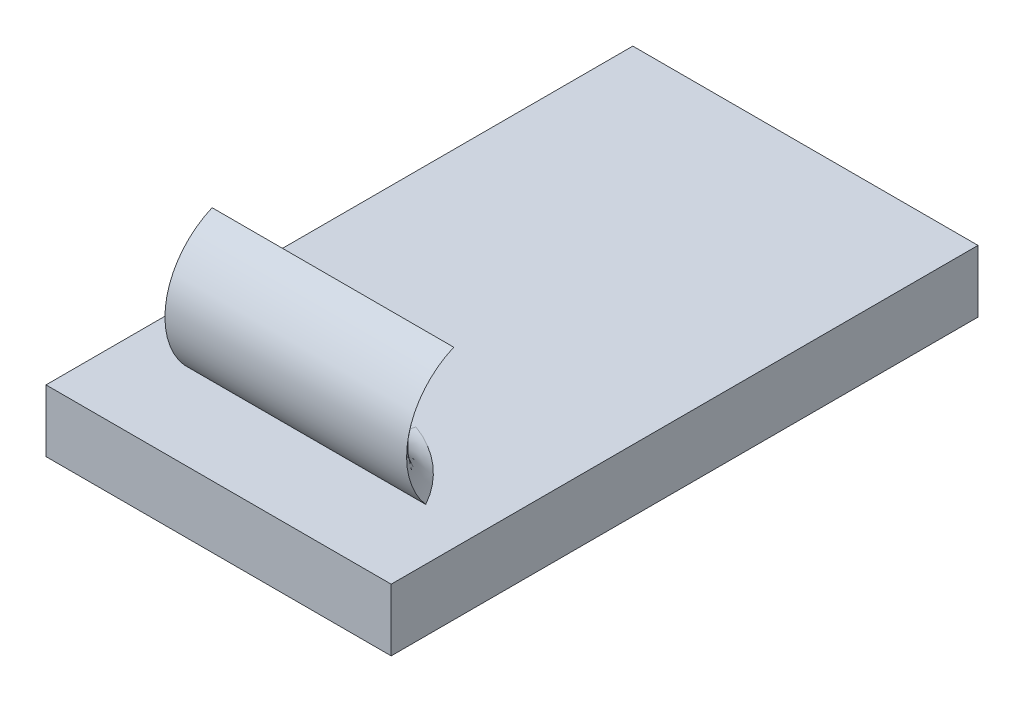
ISO-10303-21;
HEADER;
FILE_DESCRIPTION(('STEP AP214'),'2;1');
FILE_NAME('part.step','',(''),(''),'','','');
FILE_SCHEMA(('AUTOMOTIVE_DESIGN { 1 0 10303 214 1 1 1 1 }'));
ENDSEC;
DATA;
#1=APPLICATION_CONTEXT('core data for automotive mechanical design processes');
#2=APPLICATION_PROTOCOL_DEFINITION('international standard','automotive_design',2000,#1);
#3=PRODUCT_CONTEXT('',#1,'mechanical');
#4=PRODUCT('Part','Part','',(#3));
#5=PRODUCT_RELATED_PRODUCT_CATEGORY('part','',(#4));
#6=PRODUCT_DEFINITION_FORMATION('','',#4);
#7=PRODUCT_DEFINITION_CONTEXT('part definition',#1,'design');
#8=PRODUCT_DEFINITION('design','',#6,#7);
#9=PRODUCT_DEFINITION_SHAPE('','',#8);
#10=(LENGTH_UNIT() NAMED_UNIT(*) SI_UNIT(.MILLI.,.METRE.));
#11=(NAMED_UNIT(*) PLANE_ANGLE_UNIT() SI_UNIT($,.RADIAN.));
#12=(NAMED_UNIT(*) SI_UNIT($,.STERADIAN.) SOLID_ANGLE_UNIT());
#13=UNCERTAINTY_MEASURE_WITH_UNIT(LENGTH_MEASURE(1.E-05),#10,'distance_accuracy_value','');
#14=(GEOMETRIC_REPRESENTATION_CONTEXT(3) GLOBAL_UNCERTAINTY_ASSIGNED_CONTEXT((#13)) GLOBAL_UNIT_ASSIGNED_CONTEXT((#10,
#11,#12)) REPRESENTATION_CONTEXT('',''));
#15=CARTESIAN_POINT('',(0.,0.,0.));
#16=DIRECTION('',(0.,0.,1.));
#17=DIRECTION('',(1.,0.,0.));
#18=AXIS2_PLACEMENT_3D('',#15,#16,#17);
#19=CARTESIAN_POINT('',(-12.5,4.5,-21.25));
#20=DIRECTION('',(1.,0.,0.));
#21=DIRECTION('',(0.,0.,-1.));
#22=AXIS2_PLACEMENT_3D('',#19,#20,#21);
#23=PLANE('',#22);
#24=DIRECTION('',(0.,0.,1.));
#25=VECTOR('',#24,1.);
#26=CARTESIAN_POINT('',(-12.5,0.,-21.25));
#27=LINE('',#26,#25);
#28=CARTESIAN_POINT('',(-12.5,0.,-21.25));
#29=VERTEX_POINT('',#28);
#30=CARTESIAN_POINT('',(-12.5,0.,21.25));
#31=VERTEX_POINT('',#30);
#32=EDGE_CURVE('E135',#29,#31,#27,.T.);
#33=ORIENTED_EDGE('',*,*,#32,.T.);
#34=DIRECTION('',(0.,-1.,0.));
#35=VECTOR('',#34,1.);
#36=CARTESIAN_POINT('',(-12.5,4.5,21.25));
#37=LINE('',#36,#35);
#38=CARTESIAN_POINT('',(-12.5,4.5,21.25));
#39=VERTEX_POINT('',#38);
#40=EDGE_CURVE('E313',#39,#31,#37,.T.);
#41=ORIENTED_EDGE('',*,*,#40,.F.);
#42=DIRECTION('',(0.,0.,1.));
#43=VECTOR('',#42,1.);
#44=CARTESIAN_POINT('',(-12.5,4.5,-21.25));
#45=LINE('',#44,#43);
#46=CARTESIAN_POINT('',(-12.5,4.5,-21.25));
#47=VERTEX_POINT('',#46);
#48=EDGE_CURVE('E302',#47,#39,#45,.T.);
#49=ORIENTED_EDGE('',*,*,#48,.F.);
#50=DIRECTION('',(0.,-1.,0.));
#51=VECTOR('',#50,1.);
#52=CARTESIAN_POINT('',(-12.5,4.5,-21.25));
#53=LINE('',#52,#51);
#54=EDGE_CURVE('E303',#47,#29,#53,.T.);
#55=ORIENTED_EDGE('',*,*,#54,.T.);
#56=EDGE_LOOP('',(#33,#41,#49,#55));
#57=FACE_BOUND('',#56,.T.);
#58=ADVANCED_FACE('F43',(#57),#23,.F.);
#59=CARTESIAN_POINT('',(12.5,4.5,21.25));
#60=DIRECTION('',(0.,0.,-1.));
#61=DIRECTION('',(-1.,0.,0.));
#62=AXIS2_PLACEMENT_3D('',#59,#60,#61);
#63=PLANE('',#62);
#64=DIRECTION('',(1.,0.,0.));
#65=VECTOR('',#64,1.);
#66=CARTESIAN_POINT('',(12.5,0.,21.25));
#67=LINE('',#66,#65);
#68=CARTESIAN_POINT('',(12.5,0.,21.25));
#69=VERTEX_POINT('',#68);
#70=EDGE_CURVE('E287',#31,#69,#67,.T.);
#71=ORIENTED_EDGE('',*,*,#70,.T.);
#72=DIRECTION('',(0.,-1.,0.));
#73=VECTOR('',#72,1.);
#74=CARTESIAN_POINT('',(12.5,4.5,21.25));
#75=LINE('',#74,#73);
#76=CARTESIAN_POINT('',(12.5,4.5,21.25));
#77=VERTEX_POINT('',#76);
#78=EDGE_CURVE('E309',#77,#69,#75,.T.);
#79=ORIENTED_EDGE('',*,*,#78,.F.);
#80=DIRECTION('',(1.,0.,0.));
#81=VECTOR('',#80,1.);
#82=CARTESIAN_POINT('',(12.5,4.5,21.25));
#83=LINE('',#82,#81);
#84=EDGE_CURVE('E100',#39,#77,#83,.T.);
#85=ORIENTED_EDGE('',*,*,#84,.F.);
#86=ORIENTED_EDGE('',*,*,#40,.T.);
#87=EDGE_LOOP('',(#71,#79,#85,#86));
#88=FACE_BOUND('',#87,.T.);
#89=ADVANCED_FACE('F366',(#88),#63,.F.);
#90=CARTESIAN_POINT('',(12.5,4.5,-21.25));
#91=DIRECTION('',(-1.,0.,0.));
#92=DIRECTION('',(0.,0.,1.));
#93=AXIS2_PLACEMENT_3D('',#90,#91,#92);
#94=PLANE('',#93);
#95=DIRECTION('',(0.,0.,-1.));
#96=VECTOR('',#95,1.);
#97=CARTESIAN_POINT('',(12.5,0.,-21.25));
#98=LINE('',#97,#96);
#99=CARTESIAN_POINT('',(12.5,0.,-21.25));
#100=VERTEX_POINT('',#99);
#101=EDGE_CURVE('E293',#69,#100,#98,.T.);
#102=ORIENTED_EDGE('',*,*,#101,.T.);
#103=DIRECTION('',(0.,-1.,0.));
#104=VECTOR('',#103,1.);
#105=CARTESIAN_POINT('',(12.5,4.5,-21.25));
#106=LINE('',#105,#104);
#107=CARTESIAN_POINT('',(12.5,4.5,-21.25));
#108=VERTEX_POINT('',#107);
#109=EDGE_CURVE('E306',#108,#100,#106,.T.);
#110=ORIENTED_EDGE('',*,*,#109,.F.);
#111=DIRECTION('',(0.,0.,-1.));
#112=VECTOR('',#111,1.);
#113=CARTESIAN_POINT('',(12.5,4.5,-21.25));
#114=LINE('',#113,#112);
#115=EDGE_CURVE('E319',#77,#108,#114,.T.);
#116=ORIENTED_EDGE('',*,*,#115,.F.);
#117=ORIENTED_EDGE('',*,*,#78,.T.);
#118=EDGE_LOOP('',(#102,#110,#116,#117));
#119=FACE_BOUND('',#118,.T.);
#120=ADVANCED_FACE('F369',(#119),#94,.F.);
#121=CARTESIAN_POINT('',(12.5,4.5,-21.25));
#122=DIRECTION('',(0.,0.,1.));
#123=DIRECTION('',(1.,0.,0.));
#124=AXIS2_PLACEMENT_3D('',#121,#122,#123);
#125=PLANE('',#124);
#126=DIRECTION('',(-1.,0.,0.));
#127=VECTOR('',#126,1.);
#128=CARTESIAN_POINT('',(12.5,0.,-21.25));
#129=LINE('',#128,#127);
#130=EDGE_CURVE('E92',#100,#29,#129,.T.);
#131=ORIENTED_EDGE('',*,*,#130,.T.);
#132=ORIENTED_EDGE('',*,*,#54,.F.);
#133=DIRECTION('',(-1.,0.,0.));
#134=VECTOR('',#133,1.);
#135=CARTESIAN_POINT('',(12.5,4.5,-21.25));
#136=LINE('',#135,#134);
#137=EDGE_CURVE('E71',#108,#47,#136,.T.);
#138=ORIENTED_EDGE('',*,*,#137,.F.);
#139=ORIENTED_EDGE('',*,*,#109,.T.);
#140=EDGE_LOOP('',(#131,#132,#138,#139));
#141=FACE_BOUND('',#140,.T.);
#142=ADVANCED_FACE('F200',(#141),#125,.F.);
#143=CARTESIAN_POINT('',(0.,4.5,0.));
#144=DIRECTION('',(0.,-1.,0.));
#145=DIRECTION('',(0.,0.,-1.));
#146=AXIS2_PLACEMENT_3D('',#143,#144,#145);
#147=PLANE('',#146);
#148=CARTESIAN_POINT('',(8.75158639546175,4.5,14.999122952877));
#149=CARTESIAN_POINT('',(7.01685332121803,4.5,11.8613523540573));
#150=CARTESIAN_POINT('',(3.5525453268264,4.5,9.83748378716468));
#151=CARTESIAN_POINT('',(-3.55254532682639,4.5,9.83748378716468));
#152=CARTESIAN_POINT('',(-7.01685332121803,4.5,11.8613523540573));
#153=CARTESIAN_POINT('',(-8.75158639546174,4.5,14.999122952877));
#154=B_SPLINE_CURVE_WITH_KNOTS('',3,(#148,#149,#150,#151,#152,#153),.UNSPECIFIED.,.F.,.F.,(4,2,
4),(0.,0.5,1.),.UNSPECIFIED.);
#155=CARTESIAN_POINT('',(-8.75158639546174,4.5,14.999122952877));
#156=VERTEX_POINT('',#155);
#157=CARTESIAN_POINT('',(-4.15367832180881,4.5,10.7530743573293));
#158=VERTEX_POINT('',#157);
#159=EDGE_CURVE('E140',#156,#158,#154,.F.);
#160=ORIENTED_EDGE('',*,*,#159,.T.);
#161=CARTESIAN_POINT('',(-4.17923700494179,4.5,10.7800654132363));
#162=CARTESIAN_POINT('',(-4.17153734894168,4.5,10.7838449786945));
#163=CARTESIAN_POINT('',(-4.1638309216499,4.5,10.7876109210638));
#164=CARTESIAN_POINT('',(-4.04408776380803,4.5,10.8458654607411));
#165=CARTESIAN_POINT('',(-3.93064932149624,4.5,10.8975089693329));
#166=CARTESIAN_POINT('',(-3.70151279054271,4.5,10.9955365525727));
#167=CARTESIAN_POINT('',(-3.5858141694818,4.5,11.0419193700372));
#168=CARTESIAN_POINT('',(-3.35245132398132,4.5,11.1298188875885));
#169=CARTESIAN_POINT('',(-3.23478524661825,4.49999999999999,11.1713306665421));
#170=CARTESIAN_POINT('',(-2.99789884630931,4.50000000000001,11.2496678119256));
#171=CARTESIAN_POINT('',(-2.87867834101983,4.50000000000005,11.2864926229934));
#172=CARTESIAN_POINT('',(-2.51859329654463,4.49999999999991,11.3902829158637));
#173=CARTESIAN_POINT('',(-2.27572333987086,4.4999999999995,11.4504086000269));
#174=CARTESIAN_POINT('',(-1.78623954068444,4.5000000000005,11.5525930179943));
#175=CARTESIAN_POINT('',(-1.53962572215127,4.50000000000192,11.5946518674664));
#176=CARTESIAN_POINT('',(-1.0774649998236,4.5000000000017,11.6558189777679));
#177=CARTESIAN_POINT('',(-0.862226076538348,4.50000000000046,11.6772614809465));
#178=CARTESIAN_POINT('',(-0.431328131465393,4.49999999999954,11.705899588716));
#179=CARTESIAN_POINT('',(-0.215671424041904,4.49999999999986,11.7131299037809));
#180=CARTESIAN_POINT('',(0.277100309482978,4.50000000000017,11.7131269267195));
#181=CARTESIAN_POINT('',(0.554224912843561,4.50000000000005,11.7011874528933));
#182=CARTESIAN_POINT('',(1.10668018052991,4.49999999999995,11.654101858569));
#183=CARTESIAN_POINT('',(1.38200952329804,4.49999999999999,11.6189402462159));
#184=CARTESIAN_POINT('',(1.79355445078987,4.5,11.5491080513218));
#185=CARTESIAN_POINT('',(1.9312386460935,4.5,11.522791906024));
#186=CARTESIAN_POINT('',(2.20540296972312,4.5,11.4644710555701));
#187=CARTESIAN_POINT('',(2.34188312340658,4.5,11.432466470516));
#188=CARTESIAN_POINT('',(2.61327913381629,4.5,11.3628027794684));
#189=CARTESIAN_POINT('',(2.74819613630384,4.5,11.3251481399865));
#190=CARTESIAN_POINT('',(3.01628051088935,4.5,11.2440315876719));
#191=CARTESIAN_POINT('',(3.14944777319734,4.5,11.200569312324));
#192=CARTESIAN_POINT('',(3.28158452156634,4.5,11.1541384167777));
#193=B_SPLINE_CURVE_WITH_KNOTS('',3,(#161,#162,#163,#164,#165,#166,#167,#168,#169,#170,#171,
#172,#173,#174,#175,#176,#177,#178,#179,#180,#181,#182,#183,#184,#185,#186,#187,#188,#189,#190,
#191,#192),.UNSPECIFIED.,.F.,.F.,(4,2,2,2,2,2,2,2,2,2,2,2,2,2,2,4),(0.,0.0257320680699374,
0.399481117021192,0.773319295995645,1.14753196396688,1.52178893147231,2.27163777556073,
3.02148181887979,3.66993929482549,4.31681106340343,5.1479288995518,5.97960174833723,
6.40003242046417,6.82045421695531,7.24054539346426,7.66066280451871),.UNSPECIFIED.);
#194=CARTESIAN_POINT('',(3.28158452156634,4.5,11.1541384167777));
#195=VERTEX_POINT('',#194);
#196=EDGE_CURVE('E11',#158,#195,#193,.T.);
#197=ORIENTED_EDGE('',*,*,#196,.T.);
#198=CARTESIAN_POINT('',(3.53907574237027,4.5,10.5076787459085));
#199=CARTESIAN_POINT('',(3.52842918960499,4.49767323081681,10.535080137852));
#200=CARTESIAN_POINT('',(3.51774612368477,4.49563644785088,10.5624920660004));
#201=CARTESIAN_POINT('',(3.4963661942935,4.49215688739115,10.6171825195545));
#202=CARTESIAN_POINT('',(3.48566969478549,4.49071106083603,10.6444609933626));
#203=CARTESIAN_POINT('',(3.46426303782491,4.48840865929483,10.6988838403277));
#204=CARTESIAN_POINT('',(3.45355320079736,4.48754924785589,10.7260282193449));
#205=CARTESIAN_POINT('',(3.4321200270593,4.48641478637562,10.7801818325175));
#206=CARTESIAN_POINT('',(3.42139697061628,4.48613711026615,10.8071911225145));
#207=CARTESIAN_POINT('',(3.39993750694223,4.48616135040115,10.8610732738456));
#208=CARTESIAN_POINT('',(3.38920134326494,4.48646084661675,10.8879462331959));
#209=CARTESIAN_POINT('',(3.36771581177905,4.48763469793969,10.9415541733219));
#210=CARTESIAN_POINT('',(3.35696665412136,4.48850683432831,10.9682892868625));
#211=CARTESIAN_POINT('',(3.33545527889574,4.49082134531913,11.0216197341951));
#212=CARTESIAN_POINT('',(3.32469324126881,4.49226169679117,11.0482152283235));
#213=CARTESIAN_POINT('',(3.30315624227852,4.49570789790025,11.1012643659015));
#214=CARTESIAN_POINT('',(3.29238143372068,4.49771191445494,11.1277181904981));
#215=CARTESIAN_POINT('',(3.28158452156635,4.5,11.1541384167777));
#216=B_SPLINE_CURVE_WITH_KNOTS('',3,(#198,#199,#200,#201,#202,#203,#204,#205,#206,#207,#208,
#209,#210,#211,#212,#213,#214,#215),.UNSPECIFIED.,.F.,.F.,(4,2,2,2,2,2,2,2,4),(0.,
0.0884655858961985,0.176468786467049,0.264043244943356,0.35122151559867,0.438035051184154,
0.524514193307815,0.610688165834017,0.696585071351619),.UNSPECIFIED.);
#217=CARTESIAN_POINT('',(3.53978936207816,4.5,10.4939229683634));
#218=VERTEX_POINT('',#217);
#219=EDGE_CURVE('E53',#195,#218,#216,.F.);
#220=ORIENTED_EDGE('',*,*,#219,.T.);
#221=CARTESIAN_POINT('',(0.,4.5,19.8374837871647));
#222=DIRECTION('',(0.,1.,0.));
#223=DIRECTION('',(0.,0.,-1.));
#224=AXIS2_PLACEMENT_3D('',#221,#222,#223);
#225=CIRCLE('',#224,10.);
#226=CARTESIAN_POINT('',(8.75158639546175,4.5,14.999122952877));
#227=VERTEX_POINT('',#226);
#228=EDGE_CURVE('E46',#227,#218,#225,.T.);
#229=ORIENTED_EDGE('',*,*,#228,.F.);
#230=DIRECTION('',(1.,0.,0.));
#231=VECTOR('',#230,1.);
#232=CARTESIAN_POINT('',(8.75158639546174,4.5,14.999122952877));
#233=LINE('',#232,#231);
#234=EDGE_CURVE('E221',#156,#227,#233,.T.);
#235=ORIENTED_EDGE('',*,*,#234,.F.);
#236=EDGE_LOOP('',(#160,#197,#220,#229,#235));
#237=FACE_BOUND('',#236,.T.);
#238=ORIENTED_EDGE('',*,*,#48,.T.);
#239=ORIENTED_EDGE('',*,*,#84,.T.);
#240=ORIENTED_EDGE('',*,*,#115,.T.);
#241=ORIENTED_EDGE('',*,*,#137,.T.);
#242=EDGE_LOOP('',(#238,#239,#240,#241));
#243=FACE_BOUND('',#242,.T.);
#244=ADVANCED_FACE('F196',(#237,#243),#147,.F.);
#245=CARTESIAN_POINT('',(0.,0.,0.));
#246=DIRECTION('',(0.,-1.,0.));
#247=DIRECTION('',(0.,0.,-1.));
#248=AXIS2_PLACEMENT_3D('',#245,#246,#247);
#249=PLANE('',#248);
#250=CARTESIAN_POINT('',(6.5,0.,13.75));
#251=DIRECTION('',(0.,-1.,0.));
#252=DIRECTION('',(0.,0.,1.));
#253=AXIS2_PLACEMENT_3D('',#250,#251,#252);
#254=CIRCLE('',#253,4.25);
#255=CARTESIAN_POINT('',(6.5,0.,18.));
#256=VERTEX_POINT('',#255);
#257=EDGE_CURVE('E234',#256,#256,#254,.T.);
#258=ORIENTED_EDGE('',*,*,#257,.F.);
#259=EDGE_LOOP('',(#258));
#260=FACE_BOUND('',#259,.T.);
#261=CARTESIAN_POINT('',(6.5,0.,-13.75));
#262=DIRECTION('',(0.,-1.,0.));
#263=DIRECTION('',(0.,0.,-1.));
#264=AXIS2_PLACEMENT_3D('',#261,#262,#263);
#265=CIRCLE('',#264,4.25);
#266=CARTESIAN_POINT('',(6.5,0.,-18.));
#267=VERTEX_POINT('',#266);
#268=EDGE_CURVE('E258',#267,#267,#265,.T.);
#269=ORIENTED_EDGE('',*,*,#268,.F.);
#270=EDGE_LOOP('',(#269));
#271=FACE_BOUND('',#270,.T.);
#272=CARTESIAN_POINT('',(-6.5,0.,-13.75));
#273=DIRECTION('',(0.,-1.,0.));
#274=DIRECTION('',(0.,0.,1.));
#275=AXIS2_PLACEMENT_3D('',#272,#273,#274);
#276=CIRCLE('',#275,4.25);
#277=CARTESIAN_POINT('',(-6.5,0.,-9.5));
#278=VERTEX_POINT('',#277);
#279=EDGE_CURVE('E250',#278,#278,#276,.T.);
#280=ORIENTED_EDGE('',*,*,#279,.F.);
#281=EDGE_LOOP('',(#280));
#282=FACE_BOUND('',#281,.T.);
#283=CARTESIAN_POINT('',(-6.5,0.,0.));
#284=DIRECTION('',(0.,-1.,0.));
#285=DIRECTION('',(0.,0.,-1.));
#286=AXIS2_PLACEMENT_3D('',#283,#284,#285);
#287=CIRCLE('',#286,4.25);
#288=CARTESIAN_POINT('',(-6.5,0.,-4.25));
#289=VERTEX_POINT('',#288);
#290=EDGE_CURVE('E241',#289,#289,#287,.T.);
#291=ORIENTED_EDGE('',*,*,#290,.F.);
#292=EDGE_LOOP('',(#291));
#293=FACE_BOUND('',#292,.T.);
#294=CARTESIAN_POINT('',(6.5,0.,0.));
#295=DIRECTION('',(0.,-1.,0.));
#296=DIRECTION('',(0.,0.,-1.));
#297=AXIS2_PLACEMENT_3D('',#294,#295,#296);
#298=CIRCLE('',#297,4.25);
#299=CARTESIAN_POINT('',(6.5,0.,-4.25));
#300=VERTEX_POINT('',#299);
#301=EDGE_CURVE('E242',#300,#300,#298,.T.);
#302=ORIENTED_EDGE('',*,*,#301,.F.);
#303=EDGE_LOOP('',(#302));
#304=FACE_BOUND('',#303,.T.);
#305=CARTESIAN_POINT('',(-6.5,0.,13.75));
#306=DIRECTION('',(0.,-1.,0.));
#307=DIRECTION('',(0.,0.,-1.));
#308=AXIS2_PLACEMENT_3D('',#305,#306,#307);
#309=CIRCLE('',#308,4.25);
#310=CARTESIAN_POINT('',(-6.5,0.,9.5));
#311=VERTEX_POINT('',#310);
#312=EDGE_CURVE('E228',#311,#311,#309,.T.);
#313=ORIENTED_EDGE('',*,*,#312,.F.);
#314=EDGE_LOOP('',(#313));
#315=FACE_BOUND('',#314,.T.);
#316=ORIENTED_EDGE('',*,*,#32,.F.);
#317=ORIENTED_EDGE('',*,*,#130,.F.);
#318=ORIENTED_EDGE('',*,*,#101,.F.);
#319=ORIENTED_EDGE('',*,*,#70,.F.);
#320=EDGE_LOOP('',(#316,#317,#318,#319));
#321=FACE_BOUND('',#320,.T.);
#322=ADVANCED_FACE('F165',(#260,#271,#282,#293,#304,#315,#321),#249,.T.);
#323=CARTESIAN_POINT('',(8.75158639546175,4.5,14.999122952877));
#324=CARTESIAN_POINT('',(8.75158639546175,7.35483134755642,17.4954468913316));
#325=CARTESIAN_POINT('',(8.75158639546175,11.8664753507204,16.4607741396593));
#326=CARTESIAN_POINT('',(8.75158639546175,13.348244226078,12.9699209160935));
#327=CARTESIAN_POINT('',(7.01685332121803,4.5,11.8613523540573));
#328=CARTESIAN_POINT('',(7.01685332121803,5.23165435278345,14.3576763105974));
#329=CARTESIAN_POINT('',(7.01685332121803,8.22313160869522,15.4217692572305));
#330=CARTESIAN_POINT('',(7.01685332121803,10.3668905034177,13.9482533295385));
#331=CARTESIAN_POINT('',(3.5525453268264,4.5,9.83748378716468));
#332=CARTESIAN_POINT('',(3.5525453268264,3.86220077218561,12.3338077553763));
#333=CARTESIAN_POINT('',(3.5525453268264,5.87316731217738,14.7516089455739));
#334=CARTESIAN_POINT('',(3.5525453268264,8.44391114719897,14.5792797724175));
#335=CARTESIAN_POINT('',(-3.55254532682639,4.5,9.83748378716468));
#336=CARTESIAN_POINT('',(-3.55254532682639,3.86220077218561,12.3338077553763));
#337=CARTESIAN_POINT('',(-3.55254532682639,5.87316731217738,14.7516089455739));
#338=CARTESIAN_POINT('',(-3.55254532682639,8.44391114719897,14.5792797724175));
#339=CARTESIAN_POINT('',(-7.01685332121803,4.5,11.8613523540573));
#340=CARTESIAN_POINT('',(-7.01685332121803,5.23165435278446,14.3576763106008));
#341=CARTESIAN_POINT('',(-7.01685332121803,8.22313160869325,15.4217692572261));
#342=CARTESIAN_POINT('',(-7.01685332121803,10.3668905034177,13.9482533295385));
#343=CARTESIAN_POINT('',(-8.75158639546174,4.5,14.999122952877));
#344=CARTESIAN_POINT('',(-8.75158639546174,7.35483134755303,17.4954468913287));
#345=CARTESIAN_POINT('',(-8.75158639546174,11.8664753507255,16.4607741396626));
#346=CARTESIAN_POINT('',(-8.75158639546174,13.348244226078,12.9699209160934));
#347=B_SPLINE_SURFACE_WITH_KNOTS('',3,3,((#323,#324,#325,#326),(#327,#328,#329,#330),(#331,#332,
#333,#334),(#335,#336,#337,#338),(#339,#340,#341,#342),(#343,#344,#345,#346)),.UNSPECIFIED.,.F.,
.F.,.F.,(4,2,4),(4,4),(0.,0.5,1.),(0.,1.),.UNSPECIFIED.);
#348=CARTESIAN_POINT('',(-8.75158639546174,8.18923172905589,10.7800654639084));
#349=DIRECTION('',(-1.,0.,0.));
#350=DIRECTION('',(0.,-0.658257634969818,0.752792724462678));
#351=AXIS2_PLACEMENT_3D('',#348,#349,#350);
#352=CIRCLE('',#351,5.60454073460925);
#353=CARTESIAN_POINT('',(-8.75158639546174,13.348244226078,12.9699209160934));
#354=VERTEX_POINT('',#353);
#355=EDGE_CURVE('E61',#156,#354,#352,.T.);
#356=CARTESIAN_POINT('',(0.,17.9454142965424,11.4613577235174));
#357=DIRECTION('',(0.,-0.311792204890009,-0.950150314934341));
#358=DIRECTION('',(0.,-0.950150314934341,0.311792204890009));
#359=AXIS2_PLACEMENT_3D('',#356,#357,#358);
#360=CIRCLE('',#359,10.);
#361=CARTESIAN_POINT('',(8.75158639546175,13.348244226078,12.9699209160934));
#362=VERTEX_POINT('',#361);
#363=EDGE_CURVE('E119',#362,#354,#360,.T.);
#364=CARTESIAN_POINT('',(8.75158639546174,8.18923172905589,10.7800654639084));
#365=DIRECTION('',(-1.,0.,0.));
#366=DIRECTION('',(0.,-0.658257634969818,0.752792724462678));
#367=AXIS2_PLACEMENT_3D('',#364,#365,#366);
#368=CIRCLE('',#367,5.60454073460924);
#369=EDGE_CURVE('E128',#227,#362,#368,.T.);
#370=CARTESIAN_POINT('',(8.75158639546175,4.47858876489333,14.9804005233386));
#371=CARTESIAN_POINT('',(8.75158639546175,4.48572584326222,14.9866413331847));
#372=CARTESIAN_POINT('',(8.75158639546175,4.49286292163111,14.9928821430309));
#373=CARTESIAN_POINT('',(8.75158639546175,4.5,14.999122952877));
#374=CARTESIAN_POINT('',(8.75158639546175,7.35483134755642,17.4954468913316));
#375=CARTESIAN_POINT('',(8.75158639546175,11.8664753507204,16.4607741396593));
#376=CARTESIAN_POINT('',(8.75158639546175,13.348244226078,12.9699209160935));
#377=CARTESIAN_POINT('',(7.01685332121803,4.49451259235412,11.8426299243832));
#378=CARTESIAN_POINT('',(7.01685332121803,4.49634172823608,11.8488707342746));
#379=CARTESIAN_POINT('',(7.01685332121803,4.49817086411804,11.8551115441659));
#380=CARTESIAN_POINT('',(7.01685332121803,4.5,11.8613523540573));
#381=CARTESIAN_POINT('',(7.01685332121803,5.23165435278345,14.3576763105974));
#382=CARTESIAN_POINT('',(7.01685332121803,8.22313160869522,15.4217692572305));
#383=CARTESIAN_POINT('',(7.01685332121803,10.3668905034177,13.9482533295385));
#384=CARTESIAN_POINT('',(3.5525453268264,4.50478349420861,9.81876135740309));
#385=CARTESIAN_POINT('',(3.5525453268264,4.50318899613907,9.82500216732362));
#386=CARTESIAN_POINT('',(3.5525453268264,4.50159449806954,9.83124297724415));
#387=CARTESIAN_POINT('',(3.5525453268264,4.5,9.83748378716468));
#388=CARTESIAN_POINT('',(3.5525453268264,3.86220077218561,12.3338077553763));
#389=CARTESIAN_POINT('',(3.5525453268264,5.87316731217738,14.7516089455739));
#390=CARTESIAN_POINT('',(3.5525453268264,8.44391114719897,14.5792797724175));
#391=CARTESIAN_POINT('',(-3.55254532682639,4.50478349420861,9.81876135740309));
#392=CARTESIAN_POINT('',(-3.55254532682639,4.50318899613907,9.82500216732362));
#393=CARTESIAN_POINT('',(-3.55254532682639,4.50159449806954,9.83124297724415));
#394=CARTESIAN_POINT('',(-3.55254532682639,4.5,9.83748378716468));
#395=CARTESIAN_POINT('',(-3.55254532682639,3.86220077218561,12.3338077553763));
#396=CARTESIAN_POINT('',(-3.55254532682639,5.87316731217738,14.7516089455739));
#397=CARTESIAN_POINT('',(-3.55254532682639,8.44391114719897,14.5792797724175));
#398=CARTESIAN_POINT('',(-7.01685332121803,4.49451259235412,11.8426299243832));
#399=CARTESIAN_POINT('',(-7.01685332121803,4.49634172823608,11.8488707342745));
#400=CARTESIAN_POINT('',(-7.01685332121803,4.49817086411804,11.8551115441659));
#401=CARTESIAN_POINT('',(-7.01685332121803,4.5,11.8613523540573));
#402=CARTESIAN_POINT('',(-7.01685332121803,5.23165435278446,14.3576763106008));
#403=CARTESIAN_POINT('',(-7.01685332121803,8.22313160869325,15.4217692572261));
#404=CARTESIAN_POINT('',(-7.01685332121803,10.3668905034177,13.9482533295385));
#405=CARTESIAN_POINT('',(-8.75158639546174,4.47858876489335,14.9804005233386));
#406=CARTESIAN_POINT('',(-8.75158639546174,4.48572584326223,14.9866413331847));
#407=CARTESIAN_POINT('',(-8.75158639546174,4.49286292163112,14.9928821430309));
#408=CARTESIAN_POINT('',(-8.75158639546174,4.5,14.999122952877));
#409=CARTESIAN_POINT('',(-8.75158639546174,7.35483134755303,17.4954468913287));
#410=CARTESIAN_POINT('',(-8.75158639546174,11.8664753507255,16.4607741396626));
#411=CARTESIAN_POINT('',(-8.75158639546174,13.348244226078,12.9699209160934));
#412=B_SPLINE_SURFACE_WITH_KNOTS('',3,3,((#370,#371,#372,#373,#374,#375,#376),(#377,#378,#379,
#380,#381,#382,#383),(#384,#385,#386,#387,#388,#389,#390),(#391,#392,#393,#394,#395,#396,#397),
(#398,#399,#400,#401,#402,#403,#404),(#405,#406,#407,#408,#409,#410,#411)),.UNSPECIFIED.,.F.,
.F.,.F.,(4,2,4),(4,3,4),(0.,0.5,1.),(-0.0025,0.,1.),.UNSPECIFIED.);
#413=ORIENTED_EDGE('',*,*,#219,.F.);
#414=ORIENTED_EDGE('',*,*,#196,.F.);
#415=ORIENTED_EDGE('',*,*,#159,.F.);
#416=ORIENTED_EDGE('',*,*,#355,.T.);
#417=ORIENTED_EDGE('',*,*,#363,.F.);
#418=ORIENTED_EDGE('',*,*,#369,.F.);
#419=ORIENTED_EDGE('',*,*,#228,.T.);
#420=EDGE_LOOP('',(#413,#414,#415,#416,#417,#418,#419));
#421=FACE_BOUND('',#420,.T.);
#422=ADVANCED_FACE('F138',(#421),#412,.T.);
#423=CARTESIAN_POINT('',(0.,17.9454142965424,11.4613577235174));
#424=DIRECTION('',(0.,0.311792204890009,0.950150314934341));
#425=DIRECTION('',(0.,-0.950150314934341,0.311792204890009));
#426=AXIS2_PLACEMENT_3D('',#423,#424,#425);
#427=PLANE('',#426);
#428=ORIENTED_EDGE('',*,*,#363,.T.);
#429=DIRECTION('',(1.,0.,0.));
#430=VECTOR('',#429,1.);
#431=CARTESIAN_POINT('',(8.75158639546174,13.348244226078,12.9699209160935));
#432=LINE('',#431,#430);
#433=EDGE_CURVE('E122',#354,#362,#432,.T.);
#434=ORIENTED_EDGE('',*,*,#433,.T.);
#435=EDGE_LOOP('',(#428,#434));
#436=FACE_BOUND('',#435,.T.);
#437=ADVANCED_FACE('F121',(#436),#427,.F.);
#438=CARTESIAN_POINT('',(0.,8.18923172905589,10.7800654639084));
#439=DIRECTION('',(-1.,0.,0.));
#440=DIRECTION('',(0.,0.,1.));
#441=AXIS2_PLACEMENT_3D('',#438,#439,#440);
#442=CYLINDRICAL_SURFACE('',#441,5.60454073460924);
#443=ORIENTED_EDGE('',*,*,#433,.F.);
#444=ORIENTED_EDGE('',*,*,#355,.F.);
#445=ORIENTED_EDGE('',*,*,#234,.T.);
#446=ORIENTED_EDGE('',*,*,#369,.T.);
#447=EDGE_LOOP('',(#443,#444,#445,#446));
#448=FACE_BOUND('',#447,.T.);
#449=ADVANCED_FACE('F132',(#448),#442,.T.);
#450=CARTESIAN_POINT('',(-6.5,3.5,13.75));
#451=DIRECTION('',(0.,-1.,0.));
#452=DIRECTION('',(0.,0.,-1.));
#453=AXIS2_PLACEMENT_3D('',#450,#451,#452);
#454=CYLINDRICAL_SURFACE('',#453,4.25);
#455=CARTESIAN_POINT('',(-6.5,3.5,13.75));
#456=DIRECTION('',(0.,-1.,0.));
#457=DIRECTION('',(0.,0.,-1.));
#458=AXIS2_PLACEMENT_3D('',#455,#456,#457);
#459=CIRCLE('',#458,4.25);
#460=CARTESIAN_POINT('',(-6.5,3.5,9.5));
#461=VERTEX_POINT('',#460);
#462=EDGE_CURVE('E223',#461,#461,#459,.T.);
#463=ORIENTED_EDGE('',*,*,#462,.F.);
#464=EDGE_LOOP('',(#463));
#465=FACE_BOUND('',#464,.T.);
#466=ORIENTED_EDGE('',*,*,#312,.T.);
#467=EDGE_LOOP('',(#466));
#468=FACE_BOUND('',#467,.T.);
#469=ADVANCED_FACE('F166',(#465,#468),#454,.F.);
#470=CARTESIAN_POINT('',(-6.5,3.5,13.75));
#471=DIRECTION('',(0.,-1.,0.));
#472=DIRECTION('',(0.,0.,-1.));
#473=AXIS2_PLACEMENT_3D('',#470,#471,#472);
#474=PLANE('',#473);
#475=ORIENTED_EDGE('',*,*,#462,.T.);
#476=EDGE_LOOP('',(#475));
#477=FACE_BOUND('',#476,.T.);
#478=ADVANCED_FACE('F438',(#477),#474,.T.);
#479=CARTESIAN_POINT('',(6.5,3.5,0.));
#480=DIRECTION('',(0.,-1.,0.));
#481=DIRECTION('',(0.,0.,-1.));
#482=AXIS2_PLACEMENT_3D('',#479,#480,#481);
#483=CYLINDRICAL_SURFACE('',#482,4.25);
#484=CARTESIAN_POINT('',(6.5,3.5,0.));
#485=DIRECTION('',(0.,-1.,0.));
#486=DIRECTION('',(0.,0.,-1.));
#487=AXIS2_PLACEMENT_3D('',#484,#485,#486);
#488=CIRCLE('',#487,4.25);
#489=CARTESIAN_POINT('',(6.5,3.5,-4.25));
#490=VERTEX_POINT('',#489);
#491=EDGE_CURVE('E269',#490,#490,#488,.T.);
#492=ORIENTED_EDGE('',*,*,#491,.F.);
#493=EDGE_LOOP('',(#492));
#494=FACE_BOUND('',#493,.T.);
#495=ORIENTED_EDGE('',*,*,#301,.T.);
#496=EDGE_LOOP('',(#495));
#497=FACE_BOUND('',#496,.T.);
#498=ADVANCED_FACE('F277',(#494,#497),#483,.F.);
#499=CARTESIAN_POINT('',(6.5,3.5,0.));
#500=DIRECTION('',(0.,-1.,0.));
#501=DIRECTION('',(0.,0.,-1.));
#502=AXIS2_PLACEMENT_3D('',#499,#500,#501);
#503=PLANE('',#502);
#504=ORIENTED_EDGE('',*,*,#491,.T.);
#505=EDGE_LOOP('',(#504));
#506=FACE_BOUND('',#505,.T.);
#507=ADVANCED_FACE('F456',(#506),#503,.T.);
#508=CARTESIAN_POINT('',(-6.5,3.5,0.));
#509=DIRECTION('',(0.,-1.,0.));
#510=DIRECTION('',(0.,0.,-1.));
#511=AXIS2_PLACEMENT_3D('',#508,#509,#510);
#512=CYLINDRICAL_SURFACE('',#511,4.25);
#513=CARTESIAN_POINT('',(-6.5,3.5,0.));
#514=DIRECTION('',(0.,-1.,0.));
#515=DIRECTION('',(0.,0.,-1.));
#516=AXIS2_PLACEMENT_3D('',#513,#514,#515);
#517=CIRCLE('',#516,4.25);
#518=CARTESIAN_POINT('',(-6.5,3.5,-4.25));
#519=VERTEX_POINT('',#518);
#520=EDGE_CURVE('E237',#519,#519,#517,.T.);
#521=ORIENTED_EDGE('',*,*,#520,.F.);
#522=EDGE_LOOP('',(#521));
#523=FACE_BOUND('',#522,.T.);
#524=ORIENTED_EDGE('',*,*,#290,.T.);
#525=EDGE_LOOP('',(#524));
#526=FACE_BOUND('',#525,.T.);
#527=ADVANCED_FACE('F467',(#523,#526),#512,.F.);
#528=CARTESIAN_POINT('',(-6.5,3.5,0.));
#529=DIRECTION('',(0.,-1.,0.));
#530=DIRECTION('',(0.,0.,-1.));
#531=AXIS2_PLACEMENT_3D('',#528,#529,#530);
#532=PLANE('',#531);
#533=ORIENTED_EDGE('',*,*,#520,.T.);
#534=EDGE_LOOP('',(#533));
#535=FACE_BOUND('',#534,.T.);
#536=ADVANCED_FACE('F478',(#535),#532,.T.);
#537=CARTESIAN_POINT('',(-6.5,3.5,-13.75));
#538=DIRECTION('',(0.,-1.,0.));
#539=DIRECTION('',(0.,0.,-1.));
#540=AXIS2_PLACEMENT_3D('',#537,#538,#539);
#541=CYLINDRICAL_SURFACE('',#540,4.25);
#542=CARTESIAN_POINT('',(-6.5,3.5,-13.75));
#543=DIRECTION('',(0.,-1.,0.));
#544=DIRECTION('',(0.,0.,1.));
#545=AXIS2_PLACEMENT_3D('',#542,#543,#544);
#546=CIRCLE('',#545,4.25);
#547=CARTESIAN_POINT('',(-6.5,3.5,-9.5));
#548=VERTEX_POINT('',#547);
#549=EDGE_CURVE('E246',#548,#548,#546,.T.);
#550=ORIENTED_EDGE('',*,*,#549,.F.);
#551=EDGE_LOOP('',(#550));
#552=FACE_BOUND('',#551,.T.);
#553=ORIENTED_EDGE('',*,*,#279,.T.);
#554=EDGE_LOOP('',(#553));
#555=FACE_BOUND('',#554,.T.);
#556=ADVANCED_FACE('F489',(#552,#555),#541,.F.);
#557=CARTESIAN_POINT('',(-6.5,3.5,-13.75));
#558=DIRECTION('',(0.,1.,0.));
#559=DIRECTION('',(0.,0.,1.));
#560=AXIS2_PLACEMENT_3D('',#557,#558,#559);
#561=PLANE('',#560);
#562=ORIENTED_EDGE('',*,*,#549,.T.);
#563=EDGE_LOOP('',(#562));
#564=FACE_BOUND('',#563,.T.);
#565=ADVANCED_FACE('F500',(#564),#561,.F.);
#566=CARTESIAN_POINT('',(6.5,3.5,-13.75));
#567=DIRECTION('',(0.,-1.,0.));
#568=DIRECTION('',(0.,0.,-1.));
#569=AXIS2_PLACEMENT_3D('',#566,#567,#568);
#570=CYLINDRICAL_SURFACE('',#569,4.25);
#571=CARTESIAN_POINT('',(6.5,3.5,-13.75));
#572=DIRECTION('',(0.,-1.,0.));
#573=DIRECTION('',(0.,0.,-1.));
#574=AXIS2_PLACEMENT_3D('',#571,#572,#573);
#575=CIRCLE('',#574,4.25);
#576=CARTESIAN_POINT('',(6.5,3.5,-18.));
#577=VERTEX_POINT('',#576);
#578=EDGE_CURVE('E254',#577,#577,#575,.T.);
#579=ORIENTED_EDGE('',*,*,#578,.F.);
#580=EDGE_LOOP('',(#579));
#581=FACE_BOUND('',#580,.T.);
#582=ORIENTED_EDGE('',*,*,#268,.T.);
#583=EDGE_LOOP('',(#582));
#584=FACE_BOUND('',#583,.T.);
#585=ADVANCED_FACE('F511',(#581,#584),#570,.F.);
#586=CARTESIAN_POINT('',(6.5,3.5,-13.75));
#587=DIRECTION('',(0.,-1.,0.));
#588=DIRECTION('',(0.,0.,-1.));
#589=AXIS2_PLACEMENT_3D('',#586,#587,#588);
#590=PLANE('',#589);
#591=ORIENTED_EDGE('',*,*,#578,.T.);
#592=EDGE_LOOP('',(#591));
#593=FACE_BOUND('',#592,.T.);
#594=ADVANCED_FACE('F522',(#593),#590,.T.);
#595=CARTESIAN_POINT('',(6.5,3.5,13.75));
#596=DIRECTION('',(0.,-1.,0.));
#597=DIRECTION('',(0.,0.,-1.));
#598=AXIS2_PLACEMENT_3D('',#595,#596,#597);
#599=CYLINDRICAL_SURFACE('',#598,4.25);
#600=CARTESIAN_POINT('',(6.5,3.5,13.75));
#601=DIRECTION('',(0.,-1.,0.));
#602=DIRECTION('',(0.,0.,1.));
#603=AXIS2_PLACEMENT_3D('',#600,#601,#602);
#604=CIRCLE('',#603,4.25);
#605=CARTESIAN_POINT('',(6.5,3.5,18.));
#606=VERTEX_POINT('',#605);
#607=EDGE_CURVE('E262',#606,#606,#604,.T.);
#608=ORIENTED_EDGE('',*,*,#607,.F.);
#609=EDGE_LOOP('',(#608));
#610=FACE_BOUND('',#609,.T.);
#611=ORIENTED_EDGE('',*,*,#257,.T.);
#612=EDGE_LOOP('',(#611));
#613=FACE_BOUND('',#612,.T.);
#614=ADVANCED_FACE('F533',(#610,#613),#599,.F.);
#615=CARTESIAN_POINT('',(6.5,3.5,13.75));
#616=DIRECTION('',(0.,1.,0.));
#617=DIRECTION('',(0.,0.,1.));
#618=AXIS2_PLACEMENT_3D('',#615,#616,#617);
#619=PLANE('',#618);
#620=ORIENTED_EDGE('',*,*,#607,.T.);
#621=EDGE_LOOP('',(#620));
#622=FACE_BOUND('',#621,.T.);
#623=ADVANCED_FACE('F544',(#622),#619,.F.);
#624=CLOSED_SHELL('',(#58,#89,#120,#142,#244,#322,#422,#437,#449,#469,#478,#498,#507,#527,#536,
#556,#565,#585,#594,#614,#623));
#625=MANIFOLD_SOLID_BREP('B2',#624);
#626=ADVANCED_BREP_SHAPE_REPRESENTATION('',(#18,#625),#14);
#627=SHAPE_DEFINITION_REPRESENTATION(#9,#626);
ENDSEC;
END-ISO-10303-21;
